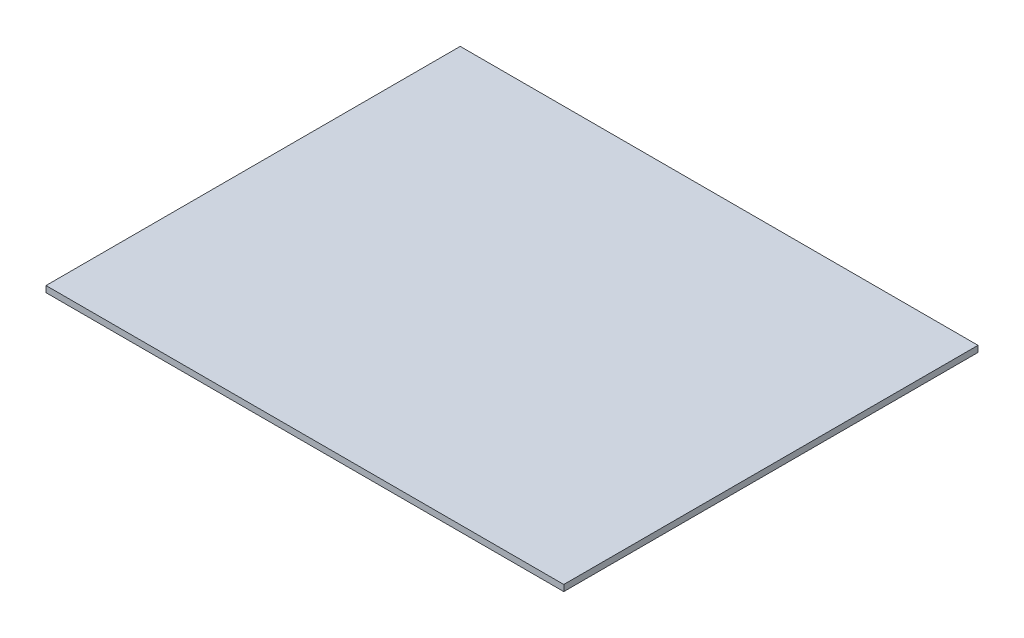
ISO-10303-21;
HEADER;
FILE_DESCRIPTION(('STEP AP214'),'2;1');
FILE_NAME('part.step','',(''),(''),'','','');
FILE_SCHEMA(('AUTOMOTIVE_DESIGN { 1 0 10303 214 1 1 1 1 }'));
ENDSEC;
DATA;
#1=APPLICATION_CONTEXT('core data for automotive mechanical design processes');
#2=APPLICATION_PROTOCOL_DEFINITION('international standard','automotive_design',2000,#1);
#3=PRODUCT_CONTEXT('',#1,'mechanical');
#4=PRODUCT('Part','Part','',(#3));
#5=PRODUCT_RELATED_PRODUCT_CATEGORY('part','',(#4));
#6=PRODUCT_DEFINITION_FORMATION('','',#4);
#7=PRODUCT_DEFINITION_CONTEXT('part definition',#1,'design');
#8=PRODUCT_DEFINITION('design','',#6,#7);
#9=PRODUCT_DEFINITION_SHAPE('','',#8);
#10=(LENGTH_UNIT() NAMED_UNIT(*) SI_UNIT(.MILLI.,.METRE.));
#11=(NAMED_UNIT(*) PLANE_ANGLE_UNIT() SI_UNIT($,.RADIAN.));
#12=(NAMED_UNIT(*) SI_UNIT($,.STERADIAN.) SOLID_ANGLE_UNIT());
#13=UNCERTAINTY_MEASURE_WITH_UNIT(LENGTH_MEASURE(1.E-05),#10,'distance_accuracy_value','');
#14=(GEOMETRIC_REPRESENTATION_CONTEXT(3) GLOBAL_UNCERTAINTY_ASSIGNED_CONTEXT((#13)) GLOBAL_UNIT_ASSIGNED_CONTEXT((#10,
#11,#12)) REPRESENTATION_CONTEXT('',''));
#15=CARTESIAN_POINT('',(0.,0.,0.));
#16=DIRECTION('',(0.,0.,1.));
#17=DIRECTION('',(1.,0.,0.));
#18=AXIS2_PLACEMENT_3D('',#15,#16,#17);
#19=CARTESIAN_POINT('',(-500.,12.,-400.));
#20=DIRECTION('',(1.,0.,0.));
#21=DIRECTION('',(0.,0.,-1.));
#22=AXIS2_PLACEMENT_3D('',#19,#20,#21);
#23=PLANE('',#22);
#24=DIRECTION('',(0.,0.,1.));
#25=VECTOR('',#24,1.);
#26=CARTESIAN_POINT('',(-500.,0.,-400.));
#27=LINE('',#26,#25);
#28=CARTESIAN_POINT('',(-500.,0.,-400.));
#29=VERTEX_POINT('',#28);
#30=CARTESIAN_POINT('',(-500.,0.,400.));
#31=VERTEX_POINT('',#30);
#32=EDGE_CURVE('E100',#29,#31,#27,.T.);
#33=ORIENTED_EDGE('',*,*,#32,.T.);
#34=DIRECTION('',(0.,-1.,0.));
#35=VECTOR('',#34,1.);
#36=CARTESIAN_POINT('',(-500.,12.,400.));
#37=LINE('',#36,#35);
#38=CARTESIAN_POINT('',(-500.,12.,400.));
#39=VERTEX_POINT('',#38);
#40=EDGE_CURVE('E11',#39,#31,#37,.T.);
#41=ORIENTED_EDGE('',*,*,#40,.F.);
#42=DIRECTION('',(0.,0.,1.));
#43=VECTOR('',#42,1.);
#44=CARTESIAN_POINT('',(-500.,12.,-400.));
#45=LINE('',#44,#43);
#46=CARTESIAN_POINT('',(-500.,12.,-400.));
#47=VERTEX_POINT('',#46);
#48=EDGE_CURVE('E88',#47,#39,#45,.T.);
#49=ORIENTED_EDGE('',*,*,#48,.F.);
#50=DIRECTION('',(0.,-1.,0.));
#51=VECTOR('',#50,1.);
#52=CARTESIAN_POINT('',(-500.,12.,-400.));
#53=LINE('',#52,#51);
#54=EDGE_CURVE('E96',#47,#29,#53,.T.);
#55=ORIENTED_EDGE('',*,*,#54,.T.);
#56=EDGE_LOOP('',(#33,#41,#49,#55));
#57=FACE_BOUND('',#56,.T.);
#58=ADVANCED_FACE('F37',(#57),#23,.F.);
#59=CARTESIAN_POINT('',(500.,12.,400.));
#60=DIRECTION('',(0.,0.,-1.));
#61=DIRECTION('',(-1.,0.,0.));
#62=AXIS2_PLACEMENT_3D('',#59,#60,#61);
#63=PLANE('',#62);
#64=DIRECTION('',(1.,0.,0.));
#65=VECTOR('',#64,1.);
#66=CARTESIAN_POINT('',(500.,0.,400.));
#67=LINE('',#66,#65);
#68=CARTESIAN_POINT('',(500.,0.,400.));
#69=VERTEX_POINT('',#68);
#70=EDGE_CURVE('E92',#31,#69,#67,.T.);
#71=ORIENTED_EDGE('',*,*,#70,.T.);
#72=DIRECTION('',(0.,-1.,0.));
#73=VECTOR('',#72,1.);
#74=CARTESIAN_POINT('',(500.,12.,400.));
#75=LINE('',#74,#73);
#76=CARTESIAN_POINT('',(500.,12.,400.));
#77=VERTEX_POINT('',#76);
#78=EDGE_CURVE('E45',#77,#69,#75,.T.);
#79=ORIENTED_EDGE('',*,*,#78,.F.);
#80=DIRECTION('',(1.,0.,0.));
#81=VECTOR('',#80,1.);
#82=CARTESIAN_POINT('',(500.,12.,400.));
#83=LINE('',#82,#81);
#84=EDGE_CURVE('E83',#39,#77,#83,.T.);
#85=ORIENTED_EDGE('',*,*,#84,.F.);
#86=ORIENTED_EDGE('',*,*,#40,.T.);
#87=EDGE_LOOP('',(#71,#79,#85,#86));
#88=FACE_BOUND('',#87,.T.);
#89=ADVANCED_FACE('F91',(#88),#63,.F.);
#90=CARTESIAN_POINT('',(500.,12.,-400.));
#91=DIRECTION('',(-1.,0.,0.));
#92=DIRECTION('',(0.,0.,1.));
#93=AXIS2_PLACEMENT_3D('',#90,#91,#92);
#94=PLANE('',#93);
#95=DIRECTION('',(0.,0.,-1.));
#96=VECTOR('',#95,1.);
#97=CARTESIAN_POINT('',(500.,0.,-400.));
#98=LINE('',#97,#96);
#99=CARTESIAN_POINT('',(500.,0.,-400.));
#100=VERTEX_POINT('',#99);
#101=EDGE_CURVE('E70',#69,#100,#98,.T.);
#102=ORIENTED_EDGE('',*,*,#101,.T.);
#103=DIRECTION('',(0.,-1.,0.));
#104=VECTOR('',#103,1.);
#105=CARTESIAN_POINT('',(500.,12.,-400.));
#106=LINE('',#105,#104);
#107=CARTESIAN_POINT('',(500.,12.,-400.));
#108=VERTEX_POINT('',#107);
#109=EDGE_CURVE('E93',#108,#100,#106,.T.);
#110=ORIENTED_EDGE('',*,*,#109,.F.);
#111=DIRECTION('',(0.,0.,-1.));
#112=VECTOR('',#111,1.);
#113=CARTESIAN_POINT('',(500.,12.,-400.));
#114=LINE('',#113,#112);
#115=EDGE_CURVE('E86',#77,#108,#114,.T.);
#116=ORIENTED_EDGE('',*,*,#115,.F.);
#117=ORIENTED_EDGE('',*,*,#78,.T.);
#118=EDGE_LOOP('',(#102,#110,#116,#117));
#119=FACE_BOUND('',#118,.T.);
#120=ADVANCED_FACE('F94',(#119),#94,.F.);
#121=CARTESIAN_POINT('',(500.,12.,-400.));
#122=DIRECTION('',(0.,0.,1.));
#123=DIRECTION('',(1.,0.,0.));
#124=AXIS2_PLACEMENT_3D('',#121,#122,#123);
#125=PLANE('',#124);
#126=DIRECTION('',(-1.,0.,0.));
#127=VECTOR('',#126,1.);
#128=CARTESIAN_POINT('',(500.,0.,-400.));
#129=LINE('',#128,#127);
#130=EDGE_CURVE('E76',#100,#29,#129,.T.);
#131=ORIENTED_EDGE('',*,*,#130,.T.);
#132=ORIENTED_EDGE('',*,*,#54,.F.);
#133=DIRECTION('',(-1.,0.,0.));
#134=VECTOR('',#133,1.);
#135=CARTESIAN_POINT('',(500.,12.,-400.));
#136=LINE('',#135,#134);
#137=EDGE_CURVE('E53',#108,#47,#136,.T.);
#138=ORIENTED_EDGE('',*,*,#137,.F.);
#139=ORIENTED_EDGE('',*,*,#109,.T.);
#140=EDGE_LOOP('',(#131,#132,#138,#139));
#141=FACE_BOUND('',#140,.T.);
#142=ADVANCED_FACE('F107',(#141),#125,.F.);
#143=CARTESIAN_POINT('',(0.,12.,0.));
#144=DIRECTION('',(0.,-1.,0.));
#145=DIRECTION('',(0.,0.,-1.));
#146=AXIS2_PLACEMENT_3D('',#143,#144,#145);
#147=PLANE('',#146);
#148=ORIENTED_EDGE('',*,*,#48,.T.);
#149=ORIENTED_EDGE('',*,*,#84,.T.);
#150=ORIENTED_EDGE('',*,*,#115,.T.);
#151=ORIENTED_EDGE('',*,*,#137,.T.);
#152=EDGE_LOOP('',(#148,#149,#150,#151));
#153=FACE_BOUND('',#152,.T.);
#154=ADVANCED_FACE('F84',(#153),#147,.F.);
#155=CARTESIAN_POINT('',(0.,0.,0.));
#156=DIRECTION('',(0.,-1.,0.));
#157=DIRECTION('',(0.,0.,-1.));
#158=AXIS2_PLACEMENT_3D('',#155,#156,#157);
#159=PLANE('',#158);
#160=ORIENTED_EDGE('',*,*,#32,.F.);
#161=ORIENTED_EDGE('',*,*,#130,.F.);
#162=ORIENTED_EDGE('',*,*,#101,.F.);
#163=ORIENTED_EDGE('',*,*,#70,.F.);
#164=EDGE_LOOP('',(#160,#161,#162,#163));
#165=FACE_BOUND('',#164,.T.);
#166=ADVANCED_FACE('F110',(#165),#159,.T.);
#167=CLOSED_SHELL('',(#58,#89,#120,#142,#154,#166));
#168=MANIFOLD_SOLID_BREP('B2',#167);
#169=ADVANCED_BREP_SHAPE_REPRESENTATION('',(#18,#168),#14);
#170=SHAPE_DEFINITION_REPRESENTATION(#9,#169);
ENDSEC;
END-ISO-10303-21;
